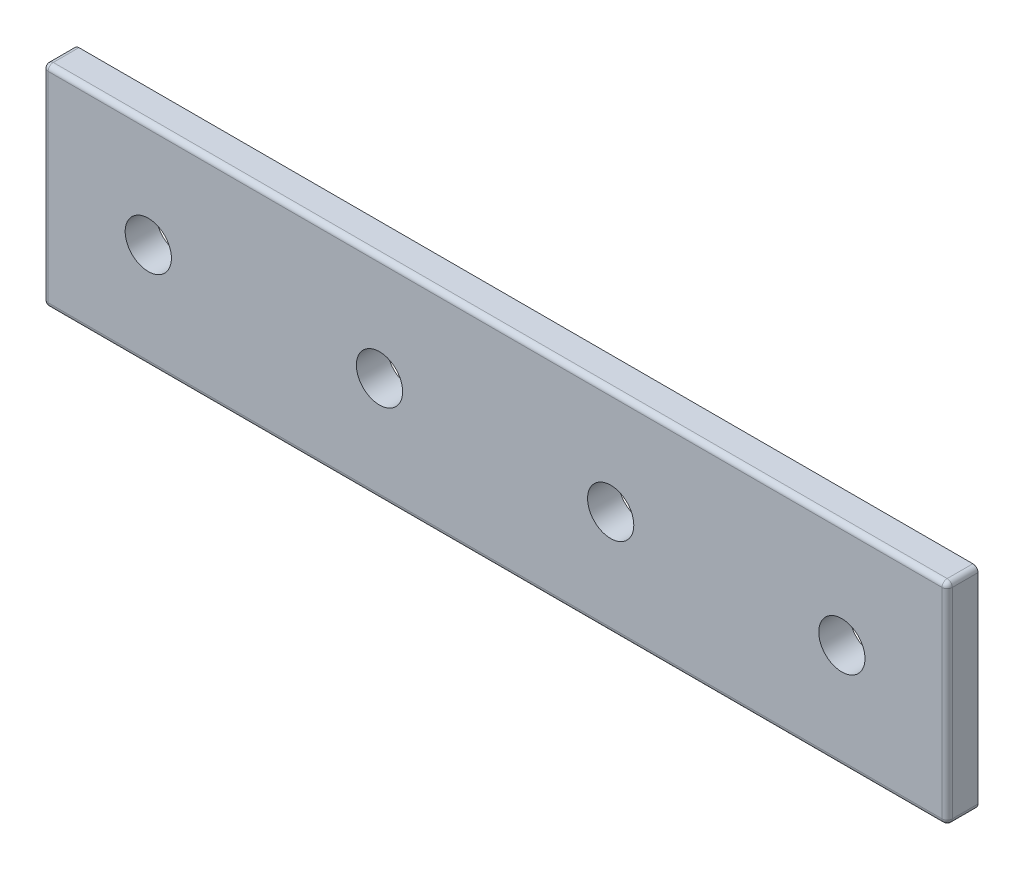
ISO-10303-21;
HEADER;
FILE_DESCRIPTION(('STEP AP214'),'2;1');
FILE_NAME('part.step','',(''),(''),'','','');
FILE_SCHEMA(('AUTOMOTIVE_DESIGN { 1 0 10303 214 1 1 1 1 }'));
ENDSEC;
DATA;
#1=APPLICATION_CONTEXT('core data for automotive mechanical design processes');
#2=APPLICATION_PROTOCOL_DEFINITION('international standard','automotive_design',2000,#1);
#3=PRODUCT_CONTEXT('',#1,'mechanical');
#4=PRODUCT('Part','Part','',(#3));
#5=PRODUCT_RELATED_PRODUCT_CATEGORY('part','',(#4));
#6=PRODUCT_DEFINITION_FORMATION('','',#4);
#7=PRODUCT_DEFINITION_CONTEXT('part definition',#1,'design');
#8=PRODUCT_DEFINITION('design','',#6,#7);
#9=PRODUCT_DEFINITION_SHAPE('','',#8);
#10=(LENGTH_UNIT() NAMED_UNIT(*) SI_UNIT(.MILLI.,.METRE.));
#11=(NAMED_UNIT(*) PLANE_ANGLE_UNIT() SI_UNIT($,.RADIAN.));
#12=(NAMED_UNIT(*) SI_UNIT($,.STERADIAN.) SOLID_ANGLE_UNIT());
#13=UNCERTAINTY_MEASURE_WITH_UNIT(LENGTH_MEASURE(1.E-05),#10,'distance_accuracy_value','');
#14=(GEOMETRIC_REPRESENTATION_CONTEXT(3) GLOBAL_UNCERTAINTY_ASSIGNED_CONTEXT((#13)) GLOBAL_UNIT_ASSIGNED_CONTEXT((#10,
#11,#12)) REPRESENTATION_CONTEXT('',''));
#15=CARTESIAN_POINT('',(0.,0.,0.));
#16=DIRECTION('',(0.,0.,1.));
#17=DIRECTION('',(1.,0.,0.));
#18=AXIS2_PLACEMENT_3D('',#15,#16,#17);
#19=CARTESIAN_POINT('',(0.,0.,3.));
#20=DIRECTION('',(0.,0.,-1.));
#21=DIRECTION('',(-1.,0.,0.));
#22=AXIS2_PLACEMENT_3D('',#19,#20,#21);
#23=PLANE('',#22);
#24=DIRECTION('',(-1.,0.,0.));
#25=VECTOR('',#24,1.);
#26=CARTESIAN_POINT('',(0.,40.,3.));
#27=LINE('',#26,#25);
#28=CARTESIAN_POINT('',(175.,40.,3.));
#29=VERTEX_POINT('',#28);
#30=CARTESIAN_POINT('',(1.,40.,3.));
#31=VERTEX_POINT('',#30);
#32=EDGE_CURVE('E287',#29,#31,#27,.T.);
#33=ORIENTED_EDGE('',*,*,#32,.T.);
#34=DIRECTION('',(0.,-1.,0.));
#35=VECTOR('',#34,1.);
#36=CARTESIAN_POINT('',(1.,0.,3.));
#37=LINE('',#36,#35);
#38=CARTESIAN_POINT('',(1.,1.,3.));
#39=VERTEX_POINT('',#38);
#40=EDGE_CURVE('E293',#31,#39,#37,.T.);
#41=ORIENTED_EDGE('',*,*,#40,.T.);
#42=DIRECTION('',(1.,0.,0.));
#43=VECTOR('',#42,1.);
#44=CARTESIAN_POINT('',(0.,1.,3.));
#45=LINE('',#44,#43);
#46=CARTESIAN_POINT('',(175.,1.00000000000001,3.));
#47=VERTEX_POINT('',#46);
#48=EDGE_CURVE('E291',#39,#47,#45,.T.);
#49=ORIENTED_EDGE('',*,*,#48,.T.);
#50=DIRECTION('',(0.,1.,0.));
#51=VECTOR('',#50,1.);
#52=CARTESIAN_POINT('',(175.,0.,3.));
#53=LINE('',#52,#51);
#54=EDGE_CURVE('E289',#47,#29,#53,.T.);
#55=ORIENTED_EDGE('',*,*,#54,.T.);
#56=EDGE_LOOP('',(#33,#41,#49,#55));
#57=FACE_BOUND('',#56,.T.);
#58=CARTESIAN_POINT('',(110.5,20.5,3.));
#59=DIRECTION('',(0.,0.,1.));
#60=DIRECTION('',(1.,0.,0.));
#61=AXIS2_PLACEMENT_3D('',#58,#59,#60);
#62=CIRCLE('',#61,4.5);
#63=CARTESIAN_POINT('',(115.,20.5,3.));
#64=VERTEX_POINT('',#63);
#65=EDGE_CURVE('E350',#64,#64,#62,.T.);
#66=ORIENTED_EDGE('',*,*,#65,.F.);
#67=EDGE_LOOP('',(#66));
#68=FACE_BOUND('',#67,.T.);
#69=CARTESIAN_POINT('',(20.5,20.5,3.));
#70=DIRECTION('',(0.,0.,1.));
#71=DIRECTION('',(1.,0.,0.));
#72=AXIS2_PLACEMENT_3D('',#69,#70,#71);
#73=CIRCLE('',#72,4.5);
#74=CARTESIAN_POINT('',(25.,20.5,3.));
#75=VERTEX_POINT('',#74);
#76=EDGE_CURVE('E263',#75,#75,#73,.T.);
#77=ORIENTED_EDGE('',*,*,#76,.F.);
#78=EDGE_LOOP('',(#77));
#79=FACE_BOUND('',#78,.T.);
#80=CARTESIAN_POINT('',(65.5,20.5,3.));
#81=DIRECTION('',(0.,0.,1.));
#82=DIRECTION('',(1.,0.,0.));
#83=AXIS2_PLACEMENT_3D('',#80,#81,#82);
#84=CIRCLE('',#83,4.5);
#85=CARTESIAN_POINT('',(70.,20.5,3.));
#86=VERTEX_POINT('',#85);
#87=EDGE_CURVE('E356',#86,#86,#84,.T.);
#88=ORIENTED_EDGE('',*,*,#87,.F.);
#89=EDGE_LOOP('',(#88));
#90=FACE_BOUND('',#89,.T.);
#91=CARTESIAN_POINT('',(155.5,20.5,3.));
#92=DIRECTION('',(0.,0.,1.));
#93=DIRECTION('',(1.,0.,0.));
#94=AXIS2_PLACEMENT_3D('',#91,#92,#93);
#95=CIRCLE('',#94,4.49999999999999);
#96=CARTESIAN_POINT('',(160.,20.5,3.));
#97=VERTEX_POINT('',#96);
#98=EDGE_CURVE('E342',#97,#97,#95,.T.);
#99=ORIENTED_EDGE('',*,*,#98,.F.);
#100=EDGE_LOOP('',(#99));
#101=FACE_BOUND('',#100,.T.);
#102=ADVANCED_FACE('F159',(#57,#68,#79,#90,#101),#23,.F.);
#103=CARTESIAN_POINT('',(0.,0.,-3.));
#104=DIRECTION('',(0.,0.,-1.));
#105=DIRECTION('',(-1.,0.,0.));
#106=AXIS2_PLACEMENT_3D('',#103,#104,#105);
#107=PLANE('',#106);
#108=CARTESIAN_POINT('',(110.5,20.5,-3.));
#109=DIRECTION('',(0.,0.,1.));
#110=DIRECTION('',(1.,0.,0.));
#111=AXIS2_PLACEMENT_3D('',#108,#109,#110);
#112=CIRCLE('',#111,4.5);
#113=CARTESIAN_POINT('',(115.,20.5,-3.));
#114=VERTEX_POINT('',#113);
#115=EDGE_CURVE('E347',#114,#114,#112,.T.);
#116=ORIENTED_EDGE('',*,*,#115,.T.);
#117=EDGE_LOOP('',(#116));
#118=FACE_BOUND('',#117,.T.);
#119=CARTESIAN_POINT('',(20.5,20.5,-3.));
#120=DIRECTION('',(0.,0.,1.));
#121=DIRECTION('',(1.,0.,0.));
#122=AXIS2_PLACEMENT_3D('',#119,#120,#121);
#123=CIRCLE('',#122,4.5);
#124=CARTESIAN_POINT('',(25.,20.5,-3.));
#125=VERTEX_POINT('',#124);
#126=EDGE_CURVE('E269',#125,#125,#123,.T.);
#127=ORIENTED_EDGE('',*,*,#126,.T.);
#128=EDGE_LOOP('',(#127));
#129=FACE_BOUND('',#128,.T.);
#130=DIRECTION('',(1.,0.,0.));
#131=VECTOR('',#130,1.);
#132=CARTESIAN_POINT('',(176.,0.,-3.));
#133=LINE('',#132,#131);
#134=CARTESIAN_POINT('',(1.,0.,-3.));
#135=VERTEX_POINT('',#134);
#136=CARTESIAN_POINT('',(175.,0.,-3.));
#137=VERTEX_POINT('',#136);
#138=EDGE_CURVE('E251',#135,#137,#133,.T.);
#139=ORIENTED_EDGE('',*,*,#138,.F.);
#140=CARTESIAN_POINT('',(1.,1.,-3.));
#141=DIRECTION('',(0.,0.,-1.));
#142=DIRECTION('',(-1.,0.,0.));
#143=AXIS2_PLACEMENT_3D('',#140,#141,#142);
#144=CIRCLE('',#143,1.);
#145=CARTESIAN_POINT('',(0.,1.,-3.));
#146=VERTEX_POINT('',#145);
#147=EDGE_CURVE('E235',#135,#146,#144,.T.);
#148=ORIENTED_EDGE('',*,*,#147,.T.);
#149=DIRECTION('',(0.,-1.,0.));
#150=VECTOR('',#149,1.);
#151=CARTESIAN_POINT('',(0.,0.,-3.));
#152=LINE('',#151,#150);
#153=CARTESIAN_POINT('',(0.,40.,-3.));
#154=VERTEX_POINT('',#153);
#155=EDGE_CURVE('E274',#154,#146,#152,.T.);
#156=ORIENTED_EDGE('',*,*,#155,.F.);
#157=CARTESIAN_POINT('',(1.,40.,-3.));
#158=DIRECTION('',(0.,0.,-1.));
#159=DIRECTION('',(-1.,0.,0.));
#160=AXIS2_PLACEMENT_3D('',#157,#158,#159);
#161=CIRCLE('',#160,1.);
#162=CARTESIAN_POINT('',(1.,41.,-3.));
#163=VERTEX_POINT('',#162);
#164=EDGE_CURVE('E256',#154,#163,#161,.T.);
#165=ORIENTED_EDGE('',*,*,#164,.T.);
#166=DIRECTION('',(-1.,0.,0.));
#167=VECTOR('',#166,1.);
#168=CARTESIAN_POINT('',(176.,41.,-3.));
#169=LINE('',#168,#167);
#170=CARTESIAN_POINT('',(175.,41.,-3.));
#171=VERTEX_POINT('',#170);
#172=EDGE_CURVE('E266',#171,#163,#169,.T.);
#173=ORIENTED_EDGE('',*,*,#172,.F.);
#174=CARTESIAN_POINT('',(175.,40.,-3.));
#175=DIRECTION('',(0.,0.,-1.));
#176=DIRECTION('',(-1.,0.,0.));
#177=AXIS2_PLACEMENT_3D('',#174,#175,#176);
#178=CIRCLE('',#177,1.);
#179=CARTESIAN_POINT('',(176.,40.,-3.));
#180=VERTEX_POINT('',#179);
#181=EDGE_CURVE('E280',#171,#180,#178,.T.);
#182=ORIENTED_EDGE('',*,*,#181,.T.);
#183=DIRECTION('',(0.,1.,0.));
#184=VECTOR('',#183,1.);
#185=CARTESIAN_POINT('',(176.,41.,-3.));
#186=LINE('',#185,#184);
#187=CARTESIAN_POINT('',(176.,1.00000000000003,-3.));
#188=VERTEX_POINT('',#187);
#189=EDGE_CURVE('E262',#188,#180,#186,.T.);
#190=ORIENTED_EDGE('',*,*,#189,.F.);
#191=CARTESIAN_POINT('',(175.,1.00000000000001,-3.));
#192=DIRECTION('',(0.,0.,-1.));
#193=DIRECTION('',(-1.,0.,0.));
#194=AXIS2_PLACEMENT_3D('',#191,#192,#193);
#195=CIRCLE('',#194,1.);
#196=EDGE_CURVE('E246',#188,#137,#195,.T.);
#197=ORIENTED_EDGE('',*,*,#196,.T.);
#198=EDGE_LOOP('',(#139,#148,#156,#165,#173,#182,#190,#197));
#199=FACE_BOUND('',#198,.T.);
#200=CARTESIAN_POINT('',(65.5,20.5,-3.));
#201=DIRECTION('',(0.,0.,1.));
#202=DIRECTION('',(1.,0.,0.));
#203=AXIS2_PLACEMENT_3D('',#200,#201,#202);
#204=CIRCLE('',#203,4.5);
#205=CARTESIAN_POINT('',(70.,20.5,-3.));
#206=VERTEX_POINT('',#205);
#207=EDGE_CURVE('E353',#206,#206,#204,.T.);
#208=ORIENTED_EDGE('',*,*,#207,.T.);
#209=EDGE_LOOP('',(#208));
#210=FACE_BOUND('',#209,.T.);
#211=CARTESIAN_POINT('',(155.5,20.5,-3.));
#212=DIRECTION('',(0.,0.,1.));
#213=DIRECTION('',(1.,0.,0.));
#214=AXIS2_PLACEMENT_3D('',#211,#212,#213);
#215=CIRCLE('',#214,4.49999999999999);
#216=CARTESIAN_POINT('',(160.,20.5,-3.));
#217=VERTEX_POINT('',#216);
#218=EDGE_CURVE('E337',#217,#217,#215,.T.);
#219=ORIENTED_EDGE('',*,*,#218,.T.);
#220=EDGE_LOOP('',(#219));
#221=FACE_BOUND('',#220,.T.);
#222=ADVANCED_FACE('F258',(#118,#129,#199,#210,#221),#107,.T.);
#223=CARTESIAN_POINT('',(176.,0.,3.));
#224=DIRECTION('',(0.,1.,0.));
#225=DIRECTION('',(-1.,0.,0.));
#226=AXIS2_PLACEMENT_3D('',#223,#224,#225);
#227=PLANE('',#226);
#228=DIRECTION('',(1.,0.,0.));
#229=VECTOR('',#228,1.);
#230=CARTESIAN_POINT('',(176.,0.,2.));
#231=LINE('',#230,#229);
#232=CARTESIAN_POINT('',(175.,0.,2.));
#233=VERTEX_POINT('',#232);
#234=CARTESIAN_POINT('',(1.,0.,2.));
#235=VERTEX_POINT('',#234);
#236=EDGE_CURVE('E254',#233,#235,#231,.F.);
#237=ORIENTED_EDGE('',*,*,#236,.T.);
#238=DIRECTION('',(0.,0.,-1.));
#239=VECTOR('',#238,1.);
#240=CARTESIAN_POINT('',(1.,0.,3.));
#241=LINE('',#240,#239);
#242=EDGE_CURVE('E239',#235,#135,#241,.T.);
#243=ORIENTED_EDGE('',*,*,#242,.T.);
#244=ORIENTED_EDGE('',*,*,#138,.T.);
#245=DIRECTION('',(0.,0.,-1.));
#246=VECTOR('',#245,1.);
#247=CARTESIAN_POINT('',(175.,0.,3.));
#248=LINE('',#247,#246);
#249=EDGE_CURVE('E276',#137,#233,#248,.F.);
#250=ORIENTED_EDGE('',*,*,#249,.T.);
#251=EDGE_LOOP('',(#237,#243,#244,#250));
#252=FACE_BOUND('',#251,.T.);
#253=ADVANCED_FACE('F250',(#252),#227,.F.);
#254=CARTESIAN_POINT('',(176.,41.,3.));
#255=DIRECTION('',(-1.,0.,0.));
#256=DIRECTION('',(0.,0.,1.));
#257=AXIS2_PLACEMENT_3D('',#254,#255,#256);
#258=PLANE('',#257);
#259=DIRECTION('',(0.,1.,0.));
#260=VECTOR('',#259,1.);
#261=CARTESIAN_POINT('',(176.,41.,2.));
#262=LINE('',#261,#260);
#263=CARTESIAN_POINT('',(176.,40.,2.));
#264=VERTEX_POINT('',#263);
#265=CARTESIAN_POINT('',(176.,1.00000000000001,2.));
#266=VERTEX_POINT('',#265);
#267=EDGE_CURVE('E298',#264,#266,#262,.F.);
#268=ORIENTED_EDGE('',*,*,#267,.T.);
#269=DIRECTION('',(0.,0.,-1.));
#270=VECTOR('',#269,1.);
#271=CARTESIAN_POINT('',(176.,1.00000000000001,3.));
#272=LINE('',#271,#270);
#273=EDGE_CURVE('E300',#266,#188,#272,.T.);
#274=ORIENTED_EDGE('',*,*,#273,.T.);
#275=ORIENTED_EDGE('',*,*,#189,.T.);
#276=DIRECTION('',(0.,0.,-1.));
#277=VECTOR('',#276,1.);
#278=CARTESIAN_POINT('',(176.,40.,3.));
#279=LINE('',#278,#277);
#280=EDGE_CURVE('E296',#180,#264,#279,.F.);
#281=ORIENTED_EDGE('',*,*,#280,.T.);
#282=EDGE_LOOP('',(#268,#274,#275,#281));
#283=FACE_BOUND('',#282,.T.);
#284=ADVANCED_FACE('F394',(#283),#258,.F.);
#285=CARTESIAN_POINT('',(176.,41.,3.));
#286=DIRECTION('',(0.,-1.,0.));
#287=DIRECTION('',(1.,0.,0.));
#288=AXIS2_PLACEMENT_3D('',#285,#286,#287);
#289=PLANE('',#288);
#290=DIRECTION('',(-1.,0.,0.));
#291=VECTOR('',#290,1.);
#292=CARTESIAN_POINT('',(176.,41.,2.));
#293=LINE('',#292,#291);
#294=CARTESIAN_POINT('',(1.,41.,2.));
#295=VERTEX_POINT('',#294);
#296=CARTESIAN_POINT('',(175.,41.,2.));
#297=VERTEX_POINT('',#296);
#298=EDGE_CURVE('E168',#295,#297,#293,.F.);
#299=ORIENTED_EDGE('',*,*,#298,.T.);
#300=DIRECTION('',(0.,0.,-1.));
#301=VECTOR('',#300,1.);
#302=CARTESIAN_POINT('',(175.,41.,3.));
#303=LINE('',#302,#301);
#304=EDGE_CURVE('E12',#297,#171,#303,.T.);
#305=ORIENTED_EDGE('',*,*,#304,.T.);
#306=ORIENTED_EDGE('',*,*,#172,.T.);
#307=DIRECTION('',(0.,0.,-1.));
#308=VECTOR('',#307,1.);
#309=CARTESIAN_POINT('',(1.,41.,3.));
#310=LINE('',#309,#308);
#311=EDGE_CURVE('E179',#163,#295,#310,.F.);
#312=ORIENTED_EDGE('',*,*,#311,.T.);
#313=EDGE_LOOP('',(#299,#305,#306,#312));
#314=FACE_BOUND('',#313,.T.);
#315=ADVANCED_FACE('F390',(#314),#289,.F.);
#316=CARTESIAN_POINT('',(0.,0.,3.));
#317=DIRECTION('',(1.,0.,0.));
#318=DIRECTION('',(0.,0.,-1.));
#319=AXIS2_PLACEMENT_3D('',#316,#317,#318);
#320=PLANE('',#319);
#321=ORIENTED_EDGE('',*,*,#155,.T.);
#322=DIRECTION('',(0.,0.,-1.));
#323=VECTOR('',#322,1.);
#324=CARTESIAN_POINT('',(0.,1.,3.));
#325=LINE('',#324,#323);
#326=CARTESIAN_POINT('',(0.,1.,2.));
#327=VERTEX_POINT('',#326);
#328=EDGE_CURVE('E240',#146,#327,#325,.F.);
#329=ORIENTED_EDGE('',*,*,#328,.T.);
#330=DIRECTION('',(0.,-1.,0.));
#331=VECTOR('',#330,1.);
#332=CARTESIAN_POINT('',(0.,0.,2.));
#333=LINE('',#332,#331);
#334=CARTESIAN_POINT('',(0.,40.,2.));
#335=VERTEX_POINT('',#334);
#336=EDGE_CURVE('E284',#327,#335,#333,.F.);
#337=ORIENTED_EDGE('',*,*,#336,.T.);
#338=DIRECTION('',(0.,0.,-1.));
#339=VECTOR('',#338,1.);
#340=CARTESIAN_POINT('',(0.,40.,3.));
#341=LINE('',#340,#339);
#342=EDGE_CURVE('E245',#335,#154,#341,.T.);
#343=ORIENTED_EDGE('',*,*,#342,.T.);
#344=EDGE_LOOP('',(#321,#329,#337,#343));
#345=FACE_BOUND('',#344,.T.);
#346=ADVANCED_FACE('F375',(#345),#320,.F.);
#347=CARTESIAN_POINT('',(20.5,20.5,3.));
#348=DIRECTION('',(0.,0.,-1.));
#349=DIRECTION('',(-1.,0.,0.));
#350=AXIS2_PLACEMENT_3D('',#347,#348,#349);
#351=CYLINDRICAL_SURFACE('',#350,4.5);
#352=ORIENTED_EDGE('',*,*,#76,.T.);
#353=EDGE_LOOP('',(#352));
#354=FACE_BOUND('',#353,.T.);
#355=ORIENTED_EDGE('',*,*,#126,.F.);
#356=EDGE_LOOP('',(#355));
#357=FACE_BOUND('',#356,.T.);
#358=ADVANCED_FACE('F365',(#354,#357),#351,.F.);
#359=CARTESIAN_POINT('',(65.5,20.5,3.));
#360=DIRECTION('',(0.,0.,-1.));
#361=DIRECTION('',(-1.,0.,0.));
#362=AXIS2_PLACEMENT_3D('',#359,#360,#361);
#363=CYLINDRICAL_SURFACE('',#362,4.5);
#364=ORIENTED_EDGE('',*,*,#87,.T.);
#365=EDGE_LOOP('',(#364));
#366=FACE_BOUND('',#365,.T.);
#367=ORIENTED_EDGE('',*,*,#207,.F.);
#368=EDGE_LOOP('',(#367));
#369=FACE_BOUND('',#368,.T.);
#370=ADVANCED_FACE('F362',(#366,#369),#363,.F.);
#371=CARTESIAN_POINT('',(110.5,20.5,3.));
#372=DIRECTION('',(0.,0.,-1.));
#373=DIRECTION('',(-1.,0.,0.));
#374=AXIS2_PLACEMENT_3D('',#371,#372,#373);
#375=CYLINDRICAL_SURFACE('',#374,4.5);
#376=ORIENTED_EDGE('',*,*,#65,.T.);
#377=EDGE_LOOP('',(#376));
#378=FACE_BOUND('',#377,.T.);
#379=ORIENTED_EDGE('',*,*,#115,.F.);
#380=EDGE_LOOP('',(#379));
#381=FACE_BOUND('',#380,.T.);
#382=ADVANCED_FACE('F364',(#378,#381),#375,.F.);
#383=CARTESIAN_POINT('',(155.5,20.5,3.));
#384=DIRECTION('',(0.,0.,-1.));
#385=DIRECTION('',(-1.,0.,0.));
#386=AXIS2_PLACEMENT_3D('',#383,#384,#385);
#387=CYLINDRICAL_SURFACE('',#386,4.49999999999999);
#388=ORIENTED_EDGE('',*,*,#98,.T.);
#389=EDGE_LOOP('',(#388));
#390=FACE_BOUND('',#389,.T.);
#391=ORIENTED_EDGE('',*,*,#218,.F.);
#392=EDGE_LOOP('',(#391));
#393=FACE_BOUND('',#392,.T.);
#394=ADVANCED_FACE('F372',(#390,#393),#387,.F.);
#395=CARTESIAN_POINT('',(175.,40.,3.));
#396=DIRECTION('',(0.,0.,-1.));
#397=DIRECTION('',(-1.,0.,0.));
#398=AXIS2_PLACEMENT_3D('',#395,#396,#397);
#399=CYLINDRICAL_SURFACE('',#398,1.);
#400=CARTESIAN_POINT('',(175.,40.,2.));
#401=DIRECTION('',(0.,0.,1.));
#402=DIRECTION('',(1.,0.,0.));
#403=AXIS2_PLACEMENT_3D('',#400,#401,#402);
#404=CIRCLE('',#403,1.);
#405=EDGE_CURVE('E163',#264,#297,#404,.T.);
#406=ORIENTED_EDGE('',*,*,#405,.F.);
#407=ORIENTED_EDGE('',*,*,#280,.F.);
#408=ORIENTED_EDGE('',*,*,#181,.F.);
#409=ORIENTED_EDGE('',*,*,#304,.F.);
#410=EDGE_LOOP('',(#406,#407,#408,#409));
#411=FACE_BOUND('',#410,.T.);
#412=ADVANCED_FACE('F161',(#411),#399,.T.);
#413=CARTESIAN_POINT('',(175.,40.,2.));
#414=DIRECTION('',(0.,0.,1.));
#415=DIRECTION('',(1.,0.,0.));
#416=AXIS2_PLACEMENT_3D('',#413,#414,#415);
#417=SPHERICAL_SURFACE('',#416,1.);
#418=CARTESIAN_POINT('',(175.,40.,2.));
#419=DIRECTION('',(0.,1.,0.));
#420=DIRECTION('',(0.,0.,1.));
#421=AXIS2_PLACEMENT_3D('',#418,#419,#420);
#422=CIRCLE('',#421,1.);
#423=EDGE_CURVE('E329',#264,#29,#422,.F.);
#424=ORIENTED_EDGE('',*,*,#423,.F.);
#425=ORIENTED_EDGE('',*,*,#405,.T.);
#426=CARTESIAN_POINT('',(175.,40.,2.));
#427=DIRECTION('',(1.,0.,0.));
#428=DIRECTION('',(0.,0.,-1.));
#429=AXIS2_PLACEMENT_3D('',#426,#427,#428);
#430=CIRCLE('',#429,1.);
#431=EDGE_CURVE('E331',#29,#297,#430,.F.);
#432=ORIENTED_EDGE('',*,*,#431,.F.);
#433=EDGE_LOOP('',(#424,#425,#432));
#434=FACE_BOUND('',#433,.T.);
#435=ADVANCED_FACE('F435',(#434),#417,.T.);
#436=CARTESIAN_POINT('',(1.,40.,3.));
#437=DIRECTION('',(0.,0.,-1.));
#438=DIRECTION('',(-1.,0.,0.));
#439=AXIS2_PLACEMENT_3D('',#436,#437,#438);
#440=CYLINDRICAL_SURFACE('',#439,1.);
#441=ORIENTED_EDGE('',*,*,#164,.F.);
#442=ORIENTED_EDGE('',*,*,#342,.F.);
#443=CARTESIAN_POINT('',(1.,40.,2.));
#444=DIRECTION('',(0.,0.,1.));
#445=DIRECTION('',(1.,0.,0.));
#446=AXIS2_PLACEMENT_3D('',#443,#444,#445);
#447=CIRCLE('',#446,1.);
#448=EDGE_CURVE('E326',#295,#335,#447,.T.);
#449=ORIENTED_EDGE('',*,*,#448,.F.);
#450=ORIENTED_EDGE('',*,*,#311,.F.);
#451=EDGE_LOOP('',(#441,#442,#449,#450));
#452=FACE_BOUND('',#451,.T.);
#453=ADVANCED_FACE('F433',(#452),#440,.T.);
#454=CARTESIAN_POINT('',(0.,40.,2.));
#455=DIRECTION('',(-1.,0.,0.));
#456=DIRECTION('',(0.,-1.,0.));
#457=AXIS2_PLACEMENT_3D('',#454,#455,#456);
#458=CYLINDRICAL_SURFACE('',#457,1.);
#459=ORIENTED_EDGE('',*,*,#431,.T.);
#460=ORIENTED_EDGE('',*,*,#298,.F.);
#461=CARTESIAN_POINT('',(1.,40.,2.));
#462=DIRECTION('',(-1.,0.,0.));
#463=DIRECTION('',(0.,-1.,0.));
#464=AXIS2_PLACEMENT_3D('',#461,#462,#463);
#465=CIRCLE('',#464,1.);
#466=EDGE_CURVE('E323',#31,#295,#465,.T.);
#467=ORIENTED_EDGE('',*,*,#466,.F.);
#468=ORIENTED_EDGE('',*,*,#32,.F.);
#469=EDGE_LOOP('',(#459,#460,#467,#468));
#470=FACE_BOUND('',#469,.T.);
#471=ADVANCED_FACE('F429',(#470),#458,.T.);
#472=CARTESIAN_POINT('',(175.,0.,2.));
#473=DIRECTION('',(0.,1.,0.));
#474=DIRECTION('',(0.,0.,1.));
#475=AXIS2_PLACEMENT_3D('',#472,#473,#474);
#476=CYLINDRICAL_SURFACE('',#475,1.);
#477=ORIENTED_EDGE('',*,*,#423,.T.);
#478=ORIENTED_EDGE('',*,*,#54,.F.);
#479=CARTESIAN_POINT('',(175.,1.00000000000001,2.));
#480=DIRECTION('',(0.,-1.,0.));
#481=DIRECTION('',(0.,0.,-1.));
#482=AXIS2_PLACEMENT_3D('',#479,#480,#481);
#483=CIRCLE('',#482,1.);
#484=EDGE_CURVE('E320',#266,#47,#483,.T.);
#485=ORIENTED_EDGE('',*,*,#484,.F.);
#486=ORIENTED_EDGE('',*,*,#267,.F.);
#487=EDGE_LOOP('',(#477,#478,#485,#486));
#488=FACE_BOUND('',#487,.T.);
#489=ADVANCED_FACE('F425',(#488),#476,.T.);
#490=CARTESIAN_POINT('',(175.,1.00000000000001,3.));
#491=DIRECTION('',(0.,0.,-1.));
#492=DIRECTION('',(-1.,0.,0.));
#493=AXIS2_PLACEMENT_3D('',#490,#491,#492);
#494=CYLINDRICAL_SURFACE('',#493,1.);
#495=ORIENTED_EDGE('',*,*,#196,.F.);
#496=ORIENTED_EDGE('',*,*,#273,.F.);
#497=CARTESIAN_POINT('',(175.,1.00000000000001,2.));
#498=DIRECTION('',(0.,0.,1.));
#499=DIRECTION('',(1.,0.,0.));
#500=AXIS2_PLACEMENT_3D('',#497,#498,#499);
#501=CIRCLE('',#500,1.);
#502=EDGE_CURVE('E317',#233,#266,#501,.T.);
#503=ORIENTED_EDGE('',*,*,#502,.F.);
#504=ORIENTED_EDGE('',*,*,#249,.F.);
#505=EDGE_LOOP('',(#495,#496,#503,#504));
#506=FACE_BOUND('',#505,.T.);
#507=ADVANCED_FACE('F421',(#506),#494,.T.);
#508=CARTESIAN_POINT('',(1.,40.,2.));
#509=DIRECTION('',(0.,0.,1.));
#510=DIRECTION('',(1.,0.,0.));
#511=AXIS2_PLACEMENT_3D('',#508,#509,#510);
#512=SPHERICAL_SURFACE('',#511,1.);
#513=ORIENTED_EDGE('',*,*,#466,.T.);
#514=ORIENTED_EDGE('',*,*,#448,.T.);
#515=CARTESIAN_POINT('',(1.,40.,2.));
#516=DIRECTION('',(0.,1.,0.));
#517=DIRECTION('',(0.,0.,1.));
#518=AXIS2_PLACEMENT_3D('',#515,#516,#517);
#519=CIRCLE('',#518,1.);
#520=EDGE_CURVE('E314',#31,#335,#519,.F.);
#521=ORIENTED_EDGE('',*,*,#520,.F.);
#522=EDGE_LOOP('',(#513,#514,#521));
#523=FACE_BOUND('',#522,.T.);
#524=ADVANCED_FACE('F417',(#523),#512,.T.);
#525=CARTESIAN_POINT('',(175.,1.00000000000001,2.));
#526=DIRECTION('',(0.,0.,1.));
#527=DIRECTION('',(1.,0.,0.));
#528=AXIS2_PLACEMENT_3D('',#525,#526,#527);
#529=SPHERICAL_SURFACE('',#528,1.);
#530=ORIENTED_EDGE('',*,*,#502,.T.);
#531=ORIENTED_EDGE('',*,*,#484,.T.);
#532=CARTESIAN_POINT('',(175.,1.00000000000001,2.));
#533=DIRECTION('',(1.,0.,0.));
#534=DIRECTION('',(0.,0.,-1.));
#535=AXIS2_PLACEMENT_3D('',#532,#533,#534);
#536=CIRCLE('',#535,1.);
#537=EDGE_CURVE('E311',#233,#47,#536,.F.);
#538=ORIENTED_EDGE('',*,*,#537,.F.);
#539=EDGE_LOOP('',(#530,#531,#538));
#540=FACE_BOUND('',#539,.T.);
#541=ADVANCED_FACE('F413',(#540),#529,.T.);
#542=CARTESIAN_POINT('',(1.,0.,2.));
#543=DIRECTION('',(0.,-1.,0.));
#544=DIRECTION('',(0.,0.,-1.));
#545=AXIS2_PLACEMENT_3D('',#542,#543,#544);
#546=CYLINDRICAL_SURFACE('',#545,1.);
#547=ORIENTED_EDGE('',*,*,#520,.T.);
#548=ORIENTED_EDGE('',*,*,#336,.F.);
#549=CARTESIAN_POINT('',(1.,1.,2.));
#550=DIRECTION('',(0.,-1.,0.));
#551=DIRECTION('',(0.,0.,-1.));
#552=AXIS2_PLACEMENT_3D('',#549,#550,#551);
#553=CIRCLE('',#552,1.);
#554=EDGE_CURVE('E308',#39,#327,#553,.T.);
#555=ORIENTED_EDGE('',*,*,#554,.F.);
#556=ORIENTED_EDGE('',*,*,#40,.F.);
#557=EDGE_LOOP('',(#547,#548,#555,#556));
#558=FACE_BOUND('',#557,.T.);
#559=ADVANCED_FACE('F409',(#558),#546,.T.);
#560=CARTESIAN_POINT('',(0.,1.,2.));
#561=DIRECTION('',(1.,0.,0.));
#562=DIRECTION('',(0.,1.,0.));
#563=AXIS2_PLACEMENT_3D('',#560,#561,#562);
#564=CYLINDRICAL_SURFACE('',#563,1.);
#565=ORIENTED_EDGE('',*,*,#537,.T.);
#566=ORIENTED_EDGE('',*,*,#48,.F.);
#567=CARTESIAN_POINT('',(1.,1.,2.));
#568=DIRECTION('',(-1.,0.,0.));
#569=DIRECTION('',(0.,0.,1.));
#570=AXIS2_PLACEMENT_3D('',#567,#568,#569);
#571=CIRCLE('',#570,1.);
#572=EDGE_CURVE('E306',#235,#39,#571,.T.);
#573=ORIENTED_EDGE('',*,*,#572,.F.);
#574=ORIENTED_EDGE('',*,*,#236,.F.);
#575=EDGE_LOOP('',(#565,#566,#573,#574));
#576=FACE_BOUND('',#575,.T.);
#577=ADVANCED_FACE('F405',(#576),#564,.T.);
#578=CARTESIAN_POINT('',(1.,1.,2.));
#579=DIRECTION('',(0.,0.,1.));
#580=DIRECTION('',(1.,0.,0.));
#581=AXIS2_PLACEMENT_3D('',#578,#579,#580);
#582=SPHERICAL_SURFACE('',#581,1.);
#583=ORIENTED_EDGE('',*,*,#572,.T.);
#584=ORIENTED_EDGE('',*,*,#554,.T.);
#585=CARTESIAN_POINT('',(1.,1.,2.));
#586=DIRECTION('',(0.,0.,1.));
#587=DIRECTION('',(1.,0.,0.));
#588=AXIS2_PLACEMENT_3D('',#585,#586,#587);
#589=CIRCLE('',#588,1.);
#590=EDGE_CURVE('E304',#235,#327,#589,.F.);
#591=ORIENTED_EDGE('',*,*,#590,.F.);
#592=EDGE_LOOP('',(#583,#584,#591));
#593=FACE_BOUND('',#592,.T.);
#594=ADVANCED_FACE('F402',(#593),#582,.T.);
#595=CARTESIAN_POINT('',(1.,1.,3.));
#596=DIRECTION('',(0.,0.,-1.));
#597=DIRECTION('',(-1.,0.,0.));
#598=AXIS2_PLACEMENT_3D('',#595,#596,#597);
#599=CYLINDRICAL_SURFACE('',#598,1.);
#600=ORIENTED_EDGE('',*,*,#590,.T.);
#601=ORIENTED_EDGE('',*,*,#328,.F.);
#602=ORIENTED_EDGE('',*,*,#147,.F.);
#603=ORIENTED_EDGE('',*,*,#242,.F.);
#604=EDGE_LOOP('',(#600,#601,#602,#603));
#605=FACE_BOUND('',#604,.T.);
#606=ADVANCED_FACE('F238',(#605),#599,.T.);
#607=CLOSED_SHELL('',(#102,#222,#253,#284,#315,#346,#358,#370,#382,#394,#412,#435,#453,#471,
#489,#507,#524,#541,#559,#577,#594,#606));
#608=MANIFOLD_SOLID_BREP('B2',#607);
#609=ADVANCED_BREP_SHAPE_REPRESENTATION('',(#18,#608),#14);
#610=SHAPE_DEFINITION_REPRESENTATION(#9,#609);
ENDSEC;
END-ISO-10303-21;
